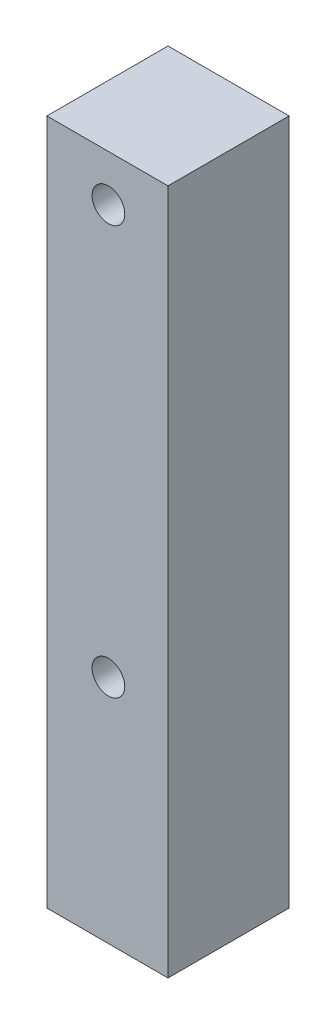
ISO-10303-21;
HEADER;
FILE_DESCRIPTION(('STEP AP214'),'2;1');
FILE_NAME('part.step','',(''),(''),'','','');
FILE_SCHEMA(('AUTOMOTIVE_DESIGN { 1 0 10303 214 1 1 1 1 }'));
ENDSEC;
DATA;
#1=APPLICATION_CONTEXT('core data for automotive mechanical design processes');
#2=APPLICATION_PROTOCOL_DEFINITION('international standard','automotive_design',2000,#1);
#3=PRODUCT_CONTEXT('',#1,'mechanical');
#4=PRODUCT('Part','Part','',(#3));
#5=PRODUCT_RELATED_PRODUCT_CATEGORY('part','',(#4));
#6=PRODUCT_DEFINITION_FORMATION('','',#4);
#7=PRODUCT_DEFINITION_CONTEXT('part definition',#1,'design');
#8=PRODUCT_DEFINITION('design','',#6,#7);
#9=PRODUCT_DEFINITION_SHAPE('','',#8);
#10=(LENGTH_UNIT() NAMED_UNIT(*) SI_UNIT(.MILLI.,.METRE.));
#11=(NAMED_UNIT(*) PLANE_ANGLE_UNIT() SI_UNIT($,.RADIAN.));
#12=(NAMED_UNIT(*) SI_UNIT($,.STERADIAN.) SOLID_ANGLE_UNIT());
#13=UNCERTAINTY_MEASURE_WITH_UNIT(LENGTH_MEASURE(1.E-05),#10,'distance_accuracy_value','');
#14=(GEOMETRIC_REPRESENTATION_CONTEXT(3) GLOBAL_UNCERTAINTY_ASSIGNED_CONTEXT((#13)) GLOBAL_UNIT_ASSIGNED_CONTEXT((#10,
#11,#12)) REPRESENTATION_CONTEXT('',''));
#15=CARTESIAN_POINT('',(0.,0.,0.));
#16=DIRECTION('',(0.,0.,1.));
#17=DIRECTION('',(1.,0.,0.));
#18=AXIS2_PLACEMENT_3D('',#15,#16,#17);
#19=CARTESIAN_POINT('',(-3.94230769230772,56.642,-4.42307692307692));
#20=DIRECTION('',(1.,0.,0.));
#21=DIRECTION('',(0.,0.,-1.));
#22=AXIS2_PLACEMENT_3D('',#19,#20,#21);
#23=PLANE('',#22);
#24=CARTESIAN_POINT('',(-3.94230769230772,12.6907109383354,0.576923076923101));
#25=DIRECTION('',(-1.,0.,0.));
#26=DIRECTION('',(0.,0.,1.));
#27=AXIS2_PLACEMENT_3D('',#24,#25,#26);
#28=CIRCLE('',#27,1.35);
#29=CARTESIAN_POINT('',(-3.94230769230772,12.6907109383354,1.9269230769231));
#30=VERTEX_POINT('',#29);
#31=EDGE_CURVE('E152',#30,#30,#28,.T.);
#32=ORIENTED_EDGE('',*,*,#31,.F.);
#33=EDGE_LOOP('',(#32));
#34=FACE_BOUND('',#33,.T.);
#35=CARTESIAN_POINT('',(-3.94230769230772,46.6420000000001,0.576923076923094));
#36=DIRECTION('',(-1.,0.,0.));
#37=DIRECTION('',(0.,0.,1.));
#38=AXIS2_PLACEMENT_3D('',#35,#36,#37);
#39=CIRCLE('',#38,1.35);
#40=CARTESIAN_POINT('',(-3.94230769230772,46.6420000000001,1.92692307692309));
#41=VERTEX_POINT('',#40);
#42=EDGE_CURVE('E143',#41,#41,#39,.T.);
#43=ORIENTED_EDGE('',*,*,#42,.F.);
#44=EDGE_LOOP('',(#43));
#45=FACE_BOUND('',#44,.T.);
#46=DIRECTION('',(0.,0.,1.));
#47=VECTOR('',#46,1.);
#48=CARTESIAN_POINT('',(-3.94230769230772,0.,-4.42307692307692));
#49=LINE('',#48,#47);
#50=CARTESIAN_POINT('',(-3.94230769230772,0.,-4.42307692307692));
#51=VERTEX_POINT('',#50);
#52=CARTESIAN_POINT('',(-3.94230769230772,0.,5.57692307692308));
#53=VERTEX_POINT('',#52);
#54=EDGE_CURVE('E106',#51,#53,#49,.T.);
#55=ORIENTED_EDGE('',*,*,#54,.T.);
#56=DIRECTION('',(0.,-1.,0.));
#57=VECTOR('',#56,1.);
#58=CARTESIAN_POINT('',(-3.94230769230772,56.642,5.57692307692308));
#59=LINE('',#58,#57);
#60=CARTESIAN_POINT('',(-3.94230769230772,56.642,5.57692307692308));
#61=VERTEX_POINT('',#60);
#62=EDGE_CURVE('E11',#61,#53,#59,.T.);
#63=ORIENTED_EDGE('',*,*,#62,.F.);
#64=DIRECTION('',(0.,0.,1.));
#65=VECTOR('',#64,1.);
#66=CARTESIAN_POINT('',(-3.94230769230772,56.642,-4.42307692307692));
#67=LINE('',#66,#65);
#68=CARTESIAN_POINT('',(-3.94230769230772,56.642,-4.42307692307692));
#69=VERTEX_POINT('',#68);
#70=EDGE_CURVE('E90',#69,#61,#67,.T.);
#71=ORIENTED_EDGE('',*,*,#70,.F.);
#72=DIRECTION('',(0.,-1.,0.));
#73=VECTOR('',#72,1.);
#74=CARTESIAN_POINT('',(-3.94230769230772,56.642,-4.42307692307692));
#75=LINE('',#74,#73);
#76=EDGE_CURVE('E102',#69,#51,#75,.T.);
#77=ORIENTED_EDGE('',*,*,#76,.T.);
#78=EDGE_LOOP('',(#55,#63,#71,#77));
#79=FACE_BOUND('',#78,.T.);
#80=ADVANCED_FACE('F38',(#34,#45,#79),#23,.F.);
#81=CARTESIAN_POINT('',(-3.94230769230772,56.642,5.57692307692308));
#82=DIRECTION('',(0.,0.,-1.));
#83=DIRECTION('',(-1.,0.,0.));
#84=AXIS2_PLACEMENT_3D('',#81,#82,#83);
#85=PLANE('',#84);
#86=CARTESIAN_POINT('',(1.13769230769228,19.05,5.57692307692308));
#87=DIRECTION('',(0.,0.,1.));
#88=DIRECTION('',(1.,0.,0.));
#89=AXIS2_PLACEMENT_3D('',#86,#87,#88);
#90=CIRCLE('',#89,1.35);
#91=CARTESIAN_POINT('',(2.48769230769228,19.05,5.57692307692308));
#92=VERTEX_POINT('',#91);
#93=EDGE_CURVE('E131',#92,#92,#90,.T.);
#94=ORIENTED_EDGE('',*,*,#93,.F.);
#95=EDGE_LOOP('',(#94));
#96=FACE_BOUND('',#95,.T.);
#97=CARTESIAN_POINT('',(1.13769230769228,52.832,5.57692307692308));
#98=DIRECTION('',(0.,0.,1.));
#99=DIRECTION('',(1.,0.,0.));
#100=AXIS2_PLACEMENT_3D('',#97,#98,#99);
#101=CIRCLE('',#100,1.35);
#102=CARTESIAN_POINT('',(2.48769230769228,52.832,5.57692307692308));
#103=VERTEX_POINT('',#102);
#104=EDGE_CURVE('E132',#103,#103,#101,.T.);
#105=ORIENTED_EDGE('',*,*,#104,.F.);
#106=EDGE_LOOP('',(#105));
#107=FACE_BOUND('',#106,.T.);
#108=DIRECTION('',(1.,0.,0.));
#109=VECTOR('',#108,1.);
#110=CARTESIAN_POINT('',(-3.94230769230772,0.,5.57692307692308));
#111=LINE('',#110,#109);
#112=CARTESIAN_POINT('',(6.05769230769228,0.,5.57692307692308));
#113=VERTEX_POINT('',#112);
#114=EDGE_CURVE('E95',#53,#113,#111,.T.);
#115=ORIENTED_EDGE('',*,*,#114,.T.);
#116=DIRECTION('',(0.,-1.,0.));
#117=VECTOR('',#116,1.);
#118=CARTESIAN_POINT('',(6.05769230769228,56.642,5.57692307692308));
#119=LINE('',#118,#117);
#120=CARTESIAN_POINT('',(6.05769230769228,56.642,5.57692307692308));
#121=VERTEX_POINT('',#120);
#122=EDGE_CURVE('E47',#121,#113,#119,.T.);
#123=ORIENTED_EDGE('',*,*,#122,.F.);
#124=DIRECTION('',(1.,0.,0.));
#125=VECTOR('',#124,1.);
#126=CARTESIAN_POINT('',(-3.94230769230772,56.642,5.57692307692308));
#127=LINE('',#126,#125);
#128=EDGE_CURVE('E85',#61,#121,#127,.T.);
#129=ORIENTED_EDGE('',*,*,#128,.F.);
#130=ORIENTED_EDGE('',*,*,#62,.T.);
#131=EDGE_LOOP('',(#115,#123,#129,#130));
#132=FACE_BOUND('',#131,.T.);
#133=ADVANCED_FACE('F94',(#96,#107,#132),#85,.F.);
#134=CARTESIAN_POINT('',(6.05769230769228,56.642,-4.42307692307692));
#135=DIRECTION('',(-1.,0.,0.));
#136=DIRECTION('',(0.,0.,1.));
#137=AXIS2_PLACEMENT_3D('',#134,#135,#136);
#138=PLANE('',#137);
#139=DIRECTION('',(0.,0.,-1.));
#140=VECTOR('',#139,1.);
#141=CARTESIAN_POINT('',(6.05769230769228,0.,-4.42307692307692));
#142=LINE('',#141,#140);
#143=CARTESIAN_POINT('',(6.05769230769228,0.,-4.42307692307692));
#144=VERTEX_POINT('',#143);
#145=EDGE_CURVE('E72',#113,#144,#142,.T.);
#146=ORIENTED_EDGE('',*,*,#145,.T.);
#147=DIRECTION('',(0.,-1.,0.));
#148=VECTOR('',#147,1.);
#149=CARTESIAN_POINT('',(6.05769230769228,56.642,-4.42307692307692));
#150=LINE('',#149,#148);
#151=CARTESIAN_POINT('',(6.05769230769228,56.642,-4.42307692307692));
#152=VERTEX_POINT('',#151);
#153=EDGE_CURVE('E97',#152,#144,#150,.T.);
#154=ORIENTED_EDGE('',*,*,#153,.F.);
#155=DIRECTION('',(0.,0.,-1.));
#156=VECTOR('',#155,1.);
#157=CARTESIAN_POINT('',(6.05769230769228,56.642,-4.42307692307692));
#158=LINE('',#157,#156);
#159=EDGE_CURVE('E88',#121,#152,#158,.T.);
#160=ORIENTED_EDGE('',*,*,#159,.F.);
#161=ORIENTED_EDGE('',*,*,#122,.T.);
#162=EDGE_LOOP('',(#146,#154,#160,#161));
#163=FACE_BOUND('',#162,.T.);
#164=ADVANCED_FACE('F98',(#163),#138,.F.);
#165=CARTESIAN_POINT('',(-3.94230769230772,56.642,-4.42307692307692));
#166=DIRECTION('',(0.,0.,1.));
#167=DIRECTION('',(1.,0.,0.));
#168=AXIS2_PLACEMENT_3D('',#165,#166,#167);
#169=PLANE('',#168);
#170=CARTESIAN_POINT('',(1.13769230769228,19.05,-4.42307692307692));
#171=DIRECTION('',(0.,0.,1.));
#172=DIRECTION('',(1.,0.,0.));
#173=AXIS2_PLACEMENT_3D('',#170,#171,#172);
#174=CIRCLE('',#173,1.35);
#175=CARTESIAN_POINT('',(2.48769230769228,19.05,-4.42307692307692));
#176=VERTEX_POINT('',#175);
#177=EDGE_CURVE('E110',#176,#176,#174,.F.);
#178=ORIENTED_EDGE('',*,*,#177,.F.);
#179=EDGE_LOOP('',(#178));
#180=FACE_BOUND('',#179,.T.);
#181=CARTESIAN_POINT('',(1.13769230769228,52.832,-4.42307692307692));
#182=DIRECTION('',(0.,0.,1.));
#183=DIRECTION('',(1.,0.,0.));
#184=AXIS2_PLACEMENT_3D('',#181,#182,#183);
#185=CIRCLE('',#184,1.35);
#186=CARTESIAN_POINT('',(2.48769230769228,52.832,-4.42307692307692));
#187=VERTEX_POINT('',#186);
#188=EDGE_CURVE('E127',#187,#187,#185,.F.);
#189=ORIENTED_EDGE('',*,*,#188,.F.);
#190=EDGE_LOOP('',(#189));
#191=FACE_BOUND('',#190,.T.);
#192=DIRECTION('',(-1.,0.,0.));
#193=VECTOR('',#192,1.);
#194=CARTESIAN_POINT('',(-3.94230769230772,0.,-4.42307692307692));
#195=LINE('',#194,#193);
#196=EDGE_CURVE('E78',#144,#51,#195,.T.);
#197=ORIENTED_EDGE('',*,*,#196,.T.);
#198=ORIENTED_EDGE('',*,*,#76,.F.);
#199=DIRECTION('',(-1.,0.,0.));
#200=VECTOR('',#199,1.);
#201=CARTESIAN_POINT('',(-3.94230769230772,56.642,-4.42307692307692));
#202=LINE('',#201,#200);
#203=EDGE_CURVE('E55',#152,#69,#202,.T.);
#204=ORIENTED_EDGE('',*,*,#203,.F.);
#205=ORIENTED_EDGE('',*,*,#153,.T.);
#206=EDGE_LOOP('',(#197,#198,#204,#205));
#207=FACE_BOUND('',#206,.T.);
#208=ADVANCED_FACE('F120',(#180,#191,#207),#169,.F.);
#209=CARTESIAN_POINT('',(0.,56.642,0.));
#210=DIRECTION('',(0.,1.,0.));
#211=DIRECTION('',(0.,0.,1.));
#212=AXIS2_PLACEMENT_3D('',#209,#210,#211);
#213=PLANE('',#212);
#214=ORIENTED_EDGE('',*,*,#70,.T.);
#215=ORIENTED_EDGE('',*,*,#128,.T.);
#216=ORIENTED_EDGE('',*,*,#159,.T.);
#217=ORIENTED_EDGE('',*,*,#203,.T.);
#218=EDGE_LOOP('',(#214,#215,#216,#217));
#219=FACE_BOUND('',#218,.T.);
#220=ADVANCED_FACE('F86',(#219),#213,.T.);
#221=CARTESIAN_POINT('',(0.,0.,0.));
#222=DIRECTION('',(0.,1.,0.));
#223=DIRECTION('',(0.,0.,1.));
#224=AXIS2_PLACEMENT_3D('',#221,#222,#223);
#225=PLANE('',#224);
#226=CARTESIAN_POINT('',(0.977692307692291,0.,0.4969230769231));
#227=DIRECTION('',(0.,-1.,0.));
#228=DIRECTION('',(0.,0.,-1.));
#229=AXIS2_PLACEMENT_3D('',#226,#227,#228);
#230=CIRCLE('',#229,1.48);
#231=CARTESIAN_POINT('',(0.977692307692291,0.,-0.983076923076896));
#232=VERTEX_POINT('',#231);
#233=EDGE_CURVE('E159',#232,#232,#230,.T.);
#234=ORIENTED_EDGE('',*,*,#233,.F.);
#235=EDGE_LOOP('',(#234));
#236=FACE_BOUND('',#235,.T.);
#237=ORIENTED_EDGE('',*,*,#54,.F.);
#238=ORIENTED_EDGE('',*,*,#196,.F.);
#239=ORIENTED_EDGE('',*,*,#145,.F.);
#240=ORIENTED_EDGE('',*,*,#114,.F.);
#241=EDGE_LOOP('',(#237,#238,#239,#240));
#242=FACE_BOUND('',#241,.T.);
#243=ADVANCED_FACE('F123',(#236,#242),#225,.F.);
#244=CARTESIAN_POINT('',(1.13769230769228,52.832,-8.24145354148427));
#245=DIRECTION('',(0.,0.,1.));
#246=DIRECTION('',(1.,0.,0.));
#247=AXIS2_PLACEMENT_3D('',#244,#245,#246);
#248=CYLINDRICAL_SURFACE('',#247,1.35);
#249=ORIENTED_EDGE('',*,*,#188,.T.);
#250=EDGE_LOOP('',(#249));
#251=FACE_BOUND('',#250,.T.);
#252=ORIENTED_EDGE('',*,*,#104,.T.);
#253=EDGE_LOOP('',(#252));
#254=FACE_BOUND('',#253,.T.);
#255=ADVANCED_FACE('F177',(#251,#254),#248,.F.);
#256=CARTESIAN_POINT('',(1.13769230769228,19.05,-8.24145354148427));
#257=DIRECTION('',(0.,0.,1.));
#258=DIRECTION('',(1.,0.,0.));
#259=AXIS2_PLACEMENT_3D('',#256,#257,#258);
#260=CYLINDRICAL_SURFACE('',#259,1.35);
#261=ORIENTED_EDGE('',*,*,#177,.T.);
#262=EDGE_LOOP('',(#261));
#263=FACE_BOUND('',#262,.T.);
#264=ORIENTED_EDGE('',*,*,#93,.T.);
#265=EDGE_LOOP('',(#264));
#266=FACE_BOUND('',#265,.T.);
#267=ADVANCED_FACE('F183',(#263,#266),#260,.F.);
#268=CARTESIAN_POINT('',(3.05769230769228,46.6420000000001,0.576923076923092));
#269=DIRECTION('',(-1.,0.,0.));
#270=DIRECTION('',(0.,0.,1.));
#271=AXIS2_PLACEMENT_3D('',#268,#269,#270);
#272=CYLINDRICAL_SURFACE('',#271,1.35);
#273=CARTESIAN_POINT('',(3.05769230769228,46.6420000000001,0.576923076923092));
#274=DIRECTION('',(-1.,0.,0.));
#275=DIRECTION('',(0.,0.,1.));
#276=AXIS2_PLACEMENT_3D('',#273,#274,#275);
#277=CIRCLE('',#276,1.35);
#278=CARTESIAN_POINT('',(3.05769230769228,46.6420000000001,1.92692307692309));
#279=VERTEX_POINT('',#278);
#280=EDGE_CURVE('E147',#279,#279,#277,.T.);
#281=ORIENTED_EDGE('',*,*,#280,.F.);
#282=EDGE_LOOP('',(#281));
#283=FACE_BOUND('',#282,.T.);
#284=ORIENTED_EDGE('',*,*,#42,.T.);
#285=EDGE_LOOP('',(#284));
#286=FACE_BOUND('',#285,.T.);
#287=ADVANCED_FACE('F198',(#283,#286),#272,.F.);
#288=CARTESIAN_POINT('',(3.05769230769228,46.6420000000001,0.576923076923092));
#289=DIRECTION('',(-1.,0.,0.));
#290=DIRECTION('',(0.,0.,1.));
#291=AXIS2_PLACEMENT_3D('',#288,#289,#290);
#292=PLANE('',#291);
#293=ORIENTED_EDGE('',*,*,#280,.T.);
#294=EDGE_LOOP('',(#293));
#295=FACE_BOUND('',#294,.T.);
#296=ADVANCED_FACE('F200',(#295),#292,.T.);
#297=CARTESIAN_POINT('',(3.05769230769228,12.6907109383354,0.576923076923099));
#298=DIRECTION('',(-1.,0.,0.));
#299=DIRECTION('',(0.,0.,1.));
#300=AXIS2_PLACEMENT_3D('',#297,#298,#299);
#301=CYLINDRICAL_SURFACE('',#300,1.35);
#302=CARTESIAN_POINT('',(3.05769230769228,12.6907109383354,0.576923076923099));
#303=DIRECTION('',(-1.,0.,0.));
#304=DIRECTION('',(0.,0.,1.));
#305=AXIS2_PLACEMENT_3D('',#302,#303,#304);
#306=CIRCLE('',#305,1.35);
#307=CARTESIAN_POINT('',(3.05769230769228,12.6907109383354,1.9269230769231));
#308=VERTEX_POINT('',#307);
#309=EDGE_CURVE('E136',#308,#308,#306,.T.);
#310=ORIENTED_EDGE('',*,*,#309,.F.);
#311=EDGE_LOOP('',(#310));
#312=FACE_BOUND('',#311,.T.);
#313=ORIENTED_EDGE('',*,*,#31,.T.);
#314=EDGE_LOOP('',(#313));
#315=FACE_BOUND('',#314,.T.);
#316=ADVANCED_FACE('F207',(#312,#315),#301,.F.);
#317=CARTESIAN_POINT('',(3.05769230769228,12.6907109383354,0.576923076923099));
#318=DIRECTION('',(-1.,0.,0.));
#319=DIRECTION('',(0.,0.,1.));
#320=AXIS2_PLACEMENT_3D('',#317,#318,#319);
#321=PLANE('',#320);
#322=ORIENTED_EDGE('',*,*,#309,.T.);
#323=EDGE_LOOP('',(#322));
#324=FACE_BOUND('',#323,.T.);
#325=ADVANCED_FACE('F172',(#324),#321,.T.);
#326=CARTESIAN_POINT('',(0.977692307692291,6.,0.4969230769231));
#327=DIRECTION('',(0.,-1.,0.));
#328=DIRECTION('',(0.,0.,-1.));
#329=AXIS2_PLACEMENT_3D('',#326,#327,#328);
#330=CYLINDRICAL_SURFACE('',#329,1.48);
#331=CARTESIAN_POINT('',(0.977692307692291,6.,0.4969230769231));
#332=DIRECTION('',(0.,-1.,0.));
#333=DIRECTION('',(0.,0.,-1.));
#334=AXIS2_PLACEMENT_3D('',#331,#332,#333);
#335=CIRCLE('',#334,1.48);
#336=CARTESIAN_POINT('',(0.977692307692291,6.,-0.983076923076896));
#337=VERTEX_POINT('',#336);
#338=EDGE_CURVE('E148',#337,#337,#335,.T.);
#339=ORIENTED_EDGE('',*,*,#338,.F.);
#340=EDGE_LOOP('',(#339));
#341=FACE_BOUND('',#340,.T.);
#342=ORIENTED_EDGE('',*,*,#233,.T.);
#343=EDGE_LOOP('',(#342));
#344=FACE_BOUND('',#343,.T.);
#345=ADVANCED_FACE('F169',(#341,#344),#330,.F.);
#346=CARTESIAN_POINT('',(0.977692307692291,6.,0.4969230769231));
#347=DIRECTION('',(0.,-1.,0.));
#348=DIRECTION('',(0.,0.,-1.));
#349=AXIS2_PLACEMENT_3D('',#346,#347,#348);
#350=PLANE('',#349);
#351=ORIENTED_EDGE('',*,*,#338,.T.);
#352=EDGE_LOOP('',(#351));
#353=FACE_BOUND('',#352,.T.);
#354=ADVANCED_FACE('F167',(#353),#350,.T.);
#355=CLOSED_SHELL('',(#80,#133,#164,#208,#220,#243,#255,#267,#287,#296,#316,#325,#345,#354));
#356=MANIFOLD_SOLID_BREP('B2',#355);
#357=ADVANCED_BREP_SHAPE_REPRESENTATION('',(#18,#356),#14);
#358=SHAPE_DEFINITION_REPRESENTATION(#9,#357);
ENDSEC;
END-ISO-10303-21;
